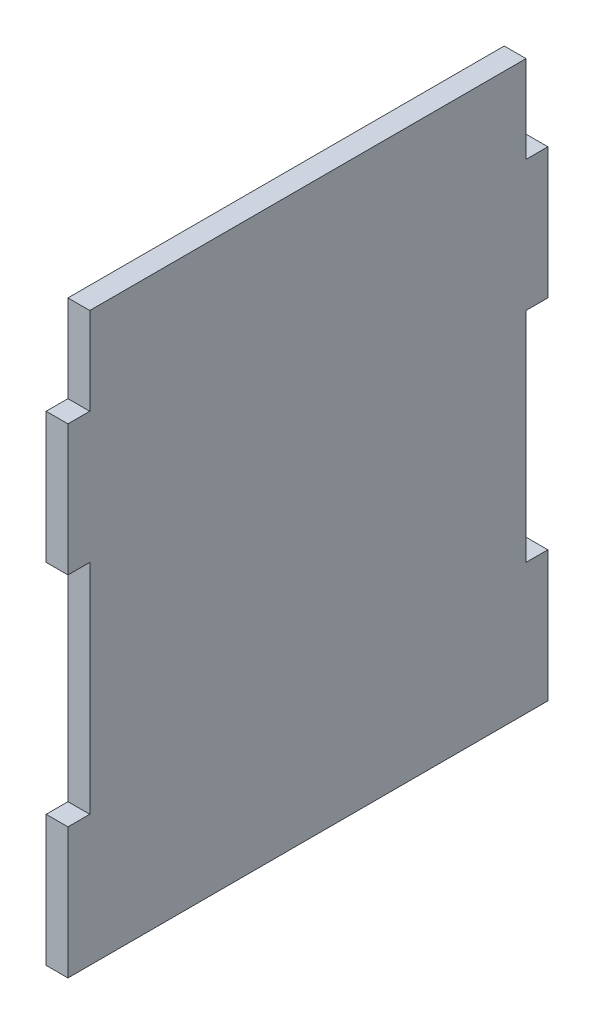
ISO-10303-21;
HEADER;
FILE_DESCRIPTION(('STEP AP214'),'2;1');
FILE_NAME('part.step','',(''),(''),'','','');
FILE_SCHEMA(('AUTOMOTIVE_DESIGN { 1 0 10303 214 1 1 1 1 }'));
ENDSEC;
DATA;
#1=APPLICATION_CONTEXT('core data for automotive mechanical design processes');
#2=APPLICATION_PROTOCOL_DEFINITION('international standard','automotive_design',2000,#1);
#3=PRODUCT_CONTEXT('',#1,'mechanical');
#4=PRODUCT('Part','Part','',(#3));
#5=PRODUCT_RELATED_PRODUCT_CATEGORY('part','',(#4));
#6=PRODUCT_DEFINITION_FORMATION('','',#4);
#7=PRODUCT_DEFINITION_CONTEXT('part definition',#1,'design');
#8=PRODUCT_DEFINITION('design','',#6,#7);
#9=PRODUCT_DEFINITION_SHAPE('','',#8);
#10=(LENGTH_UNIT() NAMED_UNIT(*) SI_UNIT(.MILLI.,.METRE.));
#11=(NAMED_UNIT(*) PLANE_ANGLE_UNIT() SI_UNIT($,.RADIAN.));
#12=(NAMED_UNIT(*) SI_UNIT($,.STERADIAN.) SOLID_ANGLE_UNIT());
#13=UNCERTAINTY_MEASURE_WITH_UNIT(LENGTH_MEASURE(1.E-05),#10,'distance_accuracy_value','');
#14=(GEOMETRIC_REPRESENTATION_CONTEXT(3) GLOBAL_UNCERTAINTY_ASSIGNED_CONTEXT((#13)) GLOBAL_UNIT_ASSIGNED_CONTEXT((#10,
#11,#12)) REPRESENTATION_CONTEXT('',''));
#15=CARTESIAN_POINT('',(0.,0.,0.));
#16=DIRECTION('',(0.,0.,1.));
#17=DIRECTION('',(1.,0.,0.));
#18=AXIS2_PLACEMENT_3D('',#15,#16,#17);
#19=CARTESIAN_POINT('',(3.175,0.,-66.675));
#20=DIRECTION('',(0.,0.,1.));
#21=DIRECTION('',(1.,0.,0.));
#22=AXIS2_PLACEMENT_3D('',#19,#20,#21);
#23=PLANE('',#22);
#24=DIRECTION('',(0.,1.,0.));
#25=VECTOR('',#24,1.);
#26=CARTESIAN_POINT('',(0.,0.,-66.675));
#27=LINE('',#26,#25);
#28=CARTESIAN_POINT('',(0.,0.,-66.675));
#29=VERTEX_POINT('',#28);
#30=CARTESIAN_POINT('',(0.,19.05,-66.675));
#31=VERTEX_POINT('',#30);
#32=EDGE_CURVE('E177',#29,#31,#27,.T.);
#33=ORIENTED_EDGE('',*,*,#32,.T.);
#34=DIRECTION('',(-1.,0.,0.));
#35=VECTOR('',#34,1.);
#36=CARTESIAN_POINT('',(3.175,19.05,-66.675));
#37=LINE('',#36,#35);
#38=CARTESIAN_POINT('',(3.175,19.05,-66.675));
#39=VERTEX_POINT('',#38);
#40=EDGE_CURVE('E41',#39,#31,#37,.T.);
#41=ORIENTED_EDGE('',*,*,#40,.F.);
#42=DIRECTION('',(0.,1.,0.));
#43=VECTOR('',#42,1.);
#44=CARTESIAN_POINT('',(3.175,0.,-66.675));
#45=LINE('',#44,#43);
#46=CARTESIAN_POINT('',(3.175,0.,-66.675));
#47=VERTEX_POINT('',#46);
#48=EDGE_CURVE('E294',#47,#39,#45,.T.);
#49=ORIENTED_EDGE('',*,*,#48,.F.);
#50=DIRECTION('',(-1.,0.,0.));
#51=VECTOR('',#50,1.);
#52=CARTESIAN_POINT('',(3.175,0.,-66.675));
#53=LINE('',#52,#51);
#54=EDGE_CURVE('E11',#47,#29,#53,.T.);
#55=ORIENTED_EDGE('',*,*,#54,.T.);
#56=EDGE_LOOP('',(#33,#41,#49,#55));
#57=FACE_BOUND('',#56,.T.);
#58=ADVANCED_FACE('F33',(#57),#23,.F.);
#59=CARTESIAN_POINT('',(3.175,19.05,-66.675));
#60=DIRECTION('',(0.,-1.,0.));
#61=DIRECTION('',(0.,0.,-1.));
#62=AXIS2_PLACEMENT_3D('',#59,#60,#61);
#63=PLANE('',#62);
#64=DIRECTION('',(0.,0.,1.));
#65=VECTOR('',#64,1.);
#66=CARTESIAN_POINT('',(0.,19.05,-66.675));
#67=LINE('',#66,#65);
#68=CARTESIAN_POINT('',(0.,19.05,-63.5));
#69=VERTEX_POINT('',#68);
#70=EDGE_CURVE('E179',#31,#69,#67,.T.);
#71=ORIENTED_EDGE('',*,*,#70,.T.);
#72=DIRECTION('',(-1.,0.,0.));
#73=VECTOR('',#72,1.);
#74=CARTESIAN_POINT('',(3.175,19.05,-63.5));
#75=LINE('',#74,#73);
#76=CARTESIAN_POINT('',(3.175,19.05,-63.5));
#77=VERTEX_POINT('',#76);
#78=EDGE_CURVE('E236',#77,#69,#75,.T.);
#79=ORIENTED_EDGE('',*,*,#78,.F.);
#80=DIRECTION('',(0.,0.,1.));
#81=VECTOR('',#80,1.);
#82=CARTESIAN_POINT('',(3.175,19.05,-66.675));
#83=LINE('',#82,#81);
#84=EDGE_CURVE('E245',#39,#77,#83,.T.);
#85=ORIENTED_EDGE('',*,*,#84,.F.);
#86=ORIENTED_EDGE('',*,*,#40,.T.);
#87=EDGE_LOOP('',(#71,#79,#85,#86));
#88=FACE_BOUND('',#87,.T.);
#89=ADVANCED_FACE('F243',(#88),#63,.F.);
#90=CARTESIAN_POINT('',(3.175,19.05,-63.5));
#91=DIRECTION('',(0.,0.,1.));
#92=DIRECTION('',(0.,-1.,0.));
#93=AXIS2_PLACEMENT_3D('',#90,#91,#92);
#94=PLANE('',#93);
#95=DIRECTION('',(0.,1.,0.));
#96=VECTOR('',#95,1.);
#97=CARTESIAN_POINT('',(0.,19.05,-63.5));
#98=LINE('',#97,#96);
#99=CARTESIAN_POINT('',(0.,50.8,-63.5000000000002));
#100=VERTEX_POINT('',#99);
#101=EDGE_CURVE('E181',#69,#100,#98,.T.);
#102=ORIENTED_EDGE('',*,*,#101,.T.);
#103=DIRECTION('',(-1.,0.,0.));
#104=VECTOR('',#103,1.);
#105=CARTESIAN_POINT('',(3.175,50.8,-63.5000000000002));
#106=LINE('',#105,#104);
#107=CARTESIAN_POINT('',(3.175,50.8,-63.5000000000002));
#108=VERTEX_POINT('',#107);
#109=EDGE_CURVE('E233',#108,#100,#106,.T.);
#110=ORIENTED_EDGE('',*,*,#109,.F.);
#111=DIRECTION('',(0.,1.,0.));
#112=VECTOR('',#111,1.);
#113=CARTESIAN_POINT('',(3.175,19.05,-63.5));
#114=LINE('',#113,#112);
#115=EDGE_CURVE('E266',#77,#108,#114,.T.);
#116=ORIENTED_EDGE('',*,*,#115,.F.);
#117=ORIENTED_EDGE('',*,*,#78,.T.);
#118=EDGE_LOOP('',(#102,#110,#116,#117));
#119=FACE_BOUND('',#118,.T.);
#120=ADVANCED_FACE('F257',(#119),#94,.F.);
#121=CARTESIAN_POINT('',(3.175,50.8,-63.5000000000002));
#122=DIRECTION('',(0.,1.,0.));
#123=DIRECTION('',(0.,0.,1.));
#124=AXIS2_PLACEMENT_3D('',#121,#122,#123);
#125=PLANE('',#124);
#126=DIRECTION('',(0.,0.,-1.));
#127=VECTOR('',#126,1.);
#128=CARTESIAN_POINT('',(0.,50.8,-63.5000000000002));
#129=LINE('',#128,#127);
#130=CARTESIAN_POINT('',(0.,50.8,-66.6750000000002));
#131=VERTEX_POINT('',#130);
#132=EDGE_CURVE('E183',#100,#131,#129,.T.);
#133=ORIENTED_EDGE('',*,*,#132,.T.);
#134=DIRECTION('',(-1.,0.,0.));
#135=VECTOR('',#134,1.);
#136=CARTESIAN_POINT('',(3.175,50.8,-66.6750000000002));
#137=LINE('',#136,#135);
#138=CARTESIAN_POINT('',(3.175,50.8,-66.6750000000002));
#139=VERTEX_POINT('',#138);
#140=EDGE_CURVE('E230',#139,#131,#137,.T.);
#141=ORIENTED_EDGE('',*,*,#140,.F.);
#142=DIRECTION('',(0.,0.,-1.));
#143=VECTOR('',#142,1.);
#144=CARTESIAN_POINT('',(3.175,50.8,-63.5000000000002));
#145=LINE('',#144,#143);
#146=EDGE_CURVE('E263',#108,#139,#145,.T.);
#147=ORIENTED_EDGE('',*,*,#146,.F.);
#148=ORIENTED_EDGE('',*,*,#109,.T.);
#149=EDGE_LOOP('',(#133,#141,#147,#148));
#150=FACE_BOUND('',#149,.T.);
#151=ADVANCED_FACE('F261',(#150),#125,.F.);
#152=CARTESIAN_POINT('',(3.175,50.8,-66.6750000000002));
#153=DIRECTION('',(0.,0.,1.));
#154=DIRECTION('',(1.,0.,0.));
#155=AXIS2_PLACEMENT_3D('',#152,#153,#154);
#156=PLANE('',#155);
#157=DIRECTION('',(0.,1.,0.));
#158=VECTOR('',#157,1.);
#159=CARTESIAN_POINT('',(0.,50.8,-66.6750000000002));
#160=LINE('',#159,#158);
#161=CARTESIAN_POINT('',(0.,69.85,-66.6750000000002));
#162=VERTEX_POINT('',#161);
#163=EDGE_CURVE('E185',#131,#162,#160,.T.);
#164=ORIENTED_EDGE('',*,*,#163,.T.);
#165=DIRECTION('',(-1.,0.,0.));
#166=VECTOR('',#165,1.);
#167=CARTESIAN_POINT('',(3.175,69.85,-66.6750000000002));
#168=LINE('',#167,#166);
#169=CARTESIAN_POINT('',(3.175,69.85,-66.6750000000002));
#170=VERTEX_POINT('',#169);
#171=EDGE_CURVE('E227',#170,#162,#168,.T.);
#172=ORIENTED_EDGE('',*,*,#171,.F.);
#173=DIRECTION('',(0.,1.,0.));
#174=VECTOR('',#173,1.);
#175=CARTESIAN_POINT('',(3.175,50.8,-66.6750000000002));
#176=LINE('',#175,#174);
#177=EDGE_CURVE('E265',#139,#170,#176,.T.);
#178=ORIENTED_EDGE('',*,*,#177,.F.);
#179=ORIENTED_EDGE('',*,*,#140,.T.);
#180=EDGE_LOOP('',(#164,#172,#178,#179));
#181=FACE_BOUND('',#180,.T.);
#182=ADVANCED_FACE('F308',(#181),#156,.F.);
#183=CARTESIAN_POINT('',(3.175,69.85,-66.6750000000002));
#184=DIRECTION('',(0.,-1.,0.));
#185=DIRECTION('',(0.,0.,-1.));
#186=AXIS2_PLACEMENT_3D('',#183,#184,#185);
#187=PLANE('',#186);
#188=DIRECTION('',(0.,0.,1.));
#189=VECTOR('',#188,1.);
#190=CARTESIAN_POINT('',(0.,69.85,-66.6750000000002));
#191=LINE('',#190,#189);
#192=CARTESIAN_POINT('',(0.,69.85,-63.5000000000002));
#193=VERTEX_POINT('',#192);
#194=EDGE_CURVE('E187',#162,#193,#191,.T.);
#195=ORIENTED_EDGE('',*,*,#194,.T.);
#196=DIRECTION('',(-1.,0.,0.));
#197=VECTOR('',#196,1.);
#198=CARTESIAN_POINT('',(3.175,69.85,-63.5000000000002));
#199=LINE('',#198,#197);
#200=CARTESIAN_POINT('',(3.175,69.85,-63.5000000000002));
#201=VERTEX_POINT('',#200);
#202=EDGE_CURVE('E224',#201,#193,#199,.T.);
#203=ORIENTED_EDGE('',*,*,#202,.F.);
#204=DIRECTION('',(0.,0.,1.));
#205=VECTOR('',#204,1.);
#206=CARTESIAN_POINT('',(3.175,69.85,-66.6750000000002));
#207=LINE('',#206,#205);
#208=EDGE_CURVE('E268',#170,#201,#207,.T.);
#209=ORIENTED_EDGE('',*,*,#208,.F.);
#210=ORIENTED_EDGE('',*,*,#171,.T.);
#211=EDGE_LOOP('',(#195,#203,#209,#210));
#212=FACE_BOUND('',#211,.T.);
#213=ADVANCED_FACE('F311',(#212),#187,.F.);
#214=CARTESIAN_POINT('',(3.175,69.85,-63.5000000000002));
#215=DIRECTION('',(0.,0.,1.));
#216=DIRECTION('',(0.,-1.,0.));
#217=AXIS2_PLACEMENT_3D('',#214,#215,#216);
#218=PLANE('',#217);
#219=DIRECTION('',(0.,1.,0.));
#220=VECTOR('',#219,1.);
#221=CARTESIAN_POINT('',(0.,69.85,-63.5000000000002));
#222=LINE('',#221,#220);
#223=CARTESIAN_POINT('',(0.,82.55,-63.5));
#224=VERTEX_POINT('',#223);
#225=EDGE_CURVE('E189',#193,#224,#222,.T.);
#226=ORIENTED_EDGE('',*,*,#225,.T.);
#227=DIRECTION('',(-1.,0.,0.));
#228=VECTOR('',#227,1.);
#229=CARTESIAN_POINT('',(3.175,82.55,-63.5));
#230=LINE('',#229,#228);
#231=CARTESIAN_POINT('',(3.175,82.55,-63.5));
#232=VERTEX_POINT('',#231);
#233=EDGE_CURVE('E221',#232,#224,#230,.T.);
#234=ORIENTED_EDGE('',*,*,#233,.F.);
#235=DIRECTION('',(0.,1.,0.));
#236=VECTOR('',#235,1.);
#237=CARTESIAN_POINT('',(3.175,69.85,-63.5000000000002));
#238=LINE('',#237,#236);
#239=EDGE_CURVE('E274',#201,#232,#238,.T.);
#240=ORIENTED_EDGE('',*,*,#239,.F.);
#241=ORIENTED_EDGE('',*,*,#202,.T.);
#242=EDGE_LOOP('',(#226,#234,#240,#241));
#243=FACE_BOUND('',#242,.T.);
#244=ADVANCED_FACE('F315',(#243),#218,.F.);
#245=CARTESIAN_POINT('',(3.175,82.55,0.));
#246=DIRECTION('',(0.,-1.,0.));
#247=DIRECTION('',(0.,0.,-1.));
#248=AXIS2_PLACEMENT_3D('',#245,#246,#247);
#249=PLANE('',#248);
#250=DIRECTION('',(0.,0.,1.));
#251=VECTOR('',#250,1.);
#252=CARTESIAN_POINT('',(0.,82.55,0.));
#253=LINE('',#252,#251);
#254=CARTESIAN_POINT('',(0.,82.55,0.));
#255=VERTEX_POINT('',#254);
#256=EDGE_CURVE('E191',#224,#255,#253,.T.);
#257=ORIENTED_EDGE('',*,*,#256,.T.);
#258=DIRECTION('',(-1.,0.,0.));
#259=VECTOR('',#258,1.);
#260=CARTESIAN_POINT('',(3.175,82.55,0.));
#261=LINE('',#260,#259);
#262=CARTESIAN_POINT('',(3.175,82.55,0.));
#263=VERTEX_POINT('',#262);
#264=EDGE_CURVE('E218',#263,#255,#261,.T.);
#265=ORIENTED_EDGE('',*,*,#264,.F.);
#266=DIRECTION('',(0.,0.,1.));
#267=VECTOR('',#266,1.);
#268=CARTESIAN_POINT('',(3.175,82.55,0.));
#269=LINE('',#268,#267);
#270=EDGE_CURVE('E276',#232,#263,#269,.T.);
#271=ORIENTED_EDGE('',*,*,#270,.F.);
#272=ORIENTED_EDGE('',*,*,#233,.T.);
#273=EDGE_LOOP('',(#257,#265,#271,#272));
#274=FACE_BOUND('',#273,.T.);
#275=ADVANCED_FACE('F319',(#274),#249,.F.);
#276=CARTESIAN_POINT('',(3.175,69.85,1.77367252013231E-13));
#277=DIRECTION('',(0.,0.,-1.));
#278=DIRECTION('',(0.,1.,0.));
#279=AXIS2_PLACEMENT_3D('',#276,#277,#278);
#280=PLANE('',#279);
#281=DIRECTION('',(0.,-1.,0.));
#282=VECTOR('',#281,1.);
#283=CARTESIAN_POINT('',(0.,69.85,1.77367252013231E-13));
#284=LINE('',#283,#282);
#285=CARTESIAN_POINT('',(0.,69.85,1.77367252013231E-13));
#286=VERTEX_POINT('',#285);
#287=EDGE_CURVE('E193',#255,#286,#284,.T.);
#288=ORIENTED_EDGE('',*,*,#287,.T.);
#289=DIRECTION('',(-1.,0.,0.));
#290=VECTOR('',#289,1.);
#291=CARTESIAN_POINT('',(3.175,69.85,1.77367252013231E-13));
#292=LINE('',#291,#290);
#293=CARTESIAN_POINT('',(3.175,69.85,1.77367252013231E-13));
#294=VERTEX_POINT('',#293);
#295=EDGE_CURVE('E215',#294,#286,#292,.T.);
#296=ORIENTED_EDGE('',*,*,#295,.F.);
#297=DIRECTION('',(0.,-1.,0.));
#298=VECTOR('',#297,1.);
#299=CARTESIAN_POINT('',(3.175,69.85,1.77367252013231E-13));
#300=LINE('',#299,#298);
#301=EDGE_CURVE('E278',#263,#294,#300,.T.);
#302=ORIENTED_EDGE('',*,*,#301,.F.);
#303=ORIENTED_EDGE('',*,*,#264,.T.);
#304=EDGE_LOOP('',(#288,#296,#302,#303));
#305=FACE_BOUND('',#304,.T.);
#306=ADVANCED_FACE('F323',(#305),#280,.F.);
#307=CARTESIAN_POINT('',(3.175,69.85,3.17500000000018));
#308=DIRECTION('',(0.,-1.,0.));
#309=DIRECTION('',(0.,0.,-1.));
#310=AXIS2_PLACEMENT_3D('',#307,#308,#309);
#311=PLANE('',#310);
#312=DIRECTION('',(0.,0.,1.));
#313=VECTOR('',#312,1.);
#314=CARTESIAN_POINT('',(0.,69.85,3.17500000000018));
#315=LINE('',#314,#313);
#316=CARTESIAN_POINT('',(0.,69.85,3.17500000000018));
#317=VERTEX_POINT('',#316);
#318=EDGE_CURVE('E195',#286,#317,#315,.T.);
#319=ORIENTED_EDGE('',*,*,#318,.T.);
#320=DIRECTION('',(-1.,0.,0.));
#321=VECTOR('',#320,1.);
#322=CARTESIAN_POINT('',(3.175,69.85,3.17500000000018));
#323=LINE('',#322,#321);
#324=CARTESIAN_POINT('',(3.175,69.85,3.17500000000018));
#325=VERTEX_POINT('',#324);
#326=EDGE_CURVE('E212',#325,#317,#323,.T.);
#327=ORIENTED_EDGE('',*,*,#326,.F.);
#328=DIRECTION('',(0.,0.,1.));
#329=VECTOR('',#328,1.);
#330=CARTESIAN_POINT('',(3.175,69.85,3.17500000000018));
#331=LINE('',#330,#329);
#332=EDGE_CURVE('E280',#294,#325,#331,.T.);
#333=ORIENTED_EDGE('',*,*,#332,.F.);
#334=ORIENTED_EDGE('',*,*,#295,.T.);
#335=EDGE_LOOP('',(#319,#327,#333,#334));
#336=FACE_BOUND('',#335,.T.);
#337=ADVANCED_FACE('F327',(#336),#311,.F.);
#338=CARTESIAN_POINT('',(3.175,50.8,3.17500000000018));
#339=DIRECTION('',(0.,0.,-1.));
#340=DIRECTION('',(-1.,0.,0.));
#341=AXIS2_PLACEMENT_3D('',#338,#339,#340);
#342=PLANE('',#341);
#343=DIRECTION('',(0.,-1.,0.));
#344=VECTOR('',#343,1.);
#345=CARTESIAN_POINT('',(0.,50.8,3.17500000000018));
#346=LINE('',#345,#344);
#347=CARTESIAN_POINT('',(0.,50.8,3.17500000000018));
#348=VERTEX_POINT('',#347);
#349=EDGE_CURVE('E197',#317,#348,#346,.T.);
#350=ORIENTED_EDGE('',*,*,#349,.T.);
#351=DIRECTION('',(-1.,0.,0.));
#352=VECTOR('',#351,1.);
#353=CARTESIAN_POINT('',(3.175,50.8,3.17500000000018));
#354=LINE('',#353,#352);
#355=CARTESIAN_POINT('',(3.175,50.8,3.17500000000018));
#356=VERTEX_POINT('',#355);
#357=EDGE_CURVE('E209',#356,#348,#354,.T.);
#358=ORIENTED_EDGE('',*,*,#357,.F.);
#359=DIRECTION('',(0.,-1.,0.));
#360=VECTOR('',#359,1.);
#361=CARTESIAN_POINT('',(3.175,50.8,3.17500000000018));
#362=LINE('',#361,#360);
#363=EDGE_CURVE('E282',#325,#356,#362,.T.);
#364=ORIENTED_EDGE('',*,*,#363,.F.);
#365=ORIENTED_EDGE('',*,*,#326,.T.);
#366=EDGE_LOOP('',(#350,#358,#364,#365));
#367=FACE_BOUND('',#366,.T.);
#368=ADVANCED_FACE('F288',(#367),#342,.F.);
#369=CARTESIAN_POINT('',(3.175,50.8,1.77367252013231E-13));
#370=DIRECTION('',(0.,1.,0.));
#371=DIRECTION('',(0.,0.,1.));
#372=AXIS2_PLACEMENT_3D('',#369,#370,#371);
#373=PLANE('',#372);
#374=DIRECTION('',(0.,0.,-1.));
#375=VECTOR('',#374,1.);
#376=CARTESIAN_POINT('',(0.,50.8,1.77367252013231E-13));
#377=LINE('',#376,#375);
#378=CARTESIAN_POINT('',(0.,50.8,1.77367252013231E-13));
#379=VERTEX_POINT('',#378);
#380=EDGE_CURVE('E199',#348,#379,#377,.T.);
#381=ORIENTED_EDGE('',*,*,#380,.T.);
#382=DIRECTION('',(-1.,0.,0.));
#383=VECTOR('',#382,1.);
#384=CARTESIAN_POINT('',(3.175,50.8,1.77367252013231E-13));
#385=LINE('',#384,#383);
#386=CARTESIAN_POINT('',(3.175,50.8,1.77367252013231E-13));
#387=VERTEX_POINT('',#386);
#388=EDGE_CURVE('E166',#387,#379,#385,.T.);
#389=ORIENTED_EDGE('',*,*,#388,.F.);
#390=DIRECTION('',(0.,0.,-1.));
#391=VECTOR('',#390,1.);
#392=CARTESIAN_POINT('',(3.175,50.8,1.77367252013231E-13));
#393=LINE('',#392,#391);
#394=EDGE_CURVE('E157',#356,#387,#393,.T.);
#395=ORIENTED_EDGE('',*,*,#394,.F.);
#396=ORIENTED_EDGE('',*,*,#357,.T.);
#397=EDGE_LOOP('',(#381,#389,#395,#396));
#398=FACE_BOUND('',#397,.T.);
#399=ADVANCED_FACE('F292',(#398),#373,.F.);
#400=CARTESIAN_POINT('',(3.175,19.05,0.));
#401=DIRECTION('',(0.,0.,-1.));
#402=DIRECTION('',(0.,1.,0.));
#403=AXIS2_PLACEMENT_3D('',#400,#401,#402);
#404=PLANE('',#403);
#405=DIRECTION('',(0.,-1.,0.));
#406=VECTOR('',#405,1.);
#407=CARTESIAN_POINT('',(0.,19.05,0.));
#408=LINE('',#407,#406);
#409=CARTESIAN_POINT('',(0.,19.05,0.));
#410=VERTEX_POINT('',#409);
#411=EDGE_CURVE('E165',#379,#410,#408,.T.);
#412=ORIENTED_EDGE('',*,*,#411,.T.);
#413=DIRECTION('',(-1.,0.,0.));
#414=VECTOR('',#413,1.);
#415=CARTESIAN_POINT('',(3.175,19.05,0.));
#416=LINE('',#415,#414);
#417=CARTESIAN_POINT('',(3.175,19.05,0.));
#418=VERTEX_POINT('',#417);
#419=EDGE_CURVE('E162',#418,#410,#416,.T.);
#420=ORIENTED_EDGE('',*,*,#419,.F.);
#421=DIRECTION('',(0.,-1.,0.));
#422=VECTOR('',#421,1.);
#423=CARTESIAN_POINT('',(3.175,19.05,0.));
#424=LINE('',#423,#422);
#425=EDGE_CURVE('E151',#387,#418,#424,.T.);
#426=ORIENTED_EDGE('',*,*,#425,.F.);
#427=ORIENTED_EDGE('',*,*,#388,.T.);
#428=EDGE_LOOP('',(#412,#420,#426,#427));
#429=FACE_BOUND('',#428,.T.);
#430=ADVANCED_FACE('F163',(#429),#404,.F.);
#431=CARTESIAN_POINT('',(3.175,19.05,3.175));
#432=DIRECTION('',(0.,-1.,0.));
#433=DIRECTION('',(0.,0.,-1.));
#434=AXIS2_PLACEMENT_3D('',#431,#432,#433);
#435=PLANE('',#434);
#436=DIRECTION('',(0.,0.,1.));
#437=VECTOR('',#436,1.);
#438=CARTESIAN_POINT('',(0.,19.05,3.175));
#439=LINE('',#438,#437);
#440=CARTESIAN_POINT('',(0.,19.05,3.175));
#441=VERTEX_POINT('',#440);
#442=EDGE_CURVE('E103',#410,#441,#439,.T.);
#443=ORIENTED_EDGE('',*,*,#442,.T.);
#444=DIRECTION('',(-1.,0.,0.));
#445=VECTOR('',#444,1.);
#446=CARTESIAN_POINT('',(3.175,19.05,3.175));
#447=LINE('',#446,#445);
#448=CARTESIAN_POINT('',(3.175,19.05,3.175));
#449=VERTEX_POINT('',#448);
#450=EDGE_CURVE('E167',#449,#441,#447,.T.);
#451=ORIENTED_EDGE('',*,*,#450,.F.);
#452=DIRECTION('',(0.,0.,1.));
#453=VECTOR('',#452,1.);
#454=CARTESIAN_POINT('',(3.175,19.05,3.175));
#455=LINE('',#454,#453);
#456=EDGE_CURVE('E155',#418,#449,#455,.T.);
#457=ORIENTED_EDGE('',*,*,#456,.F.);
#458=ORIENTED_EDGE('',*,*,#419,.T.);
#459=EDGE_LOOP('',(#443,#451,#457,#458));
#460=FACE_BOUND('',#459,.T.);
#461=ADVANCED_FACE('F169',(#460),#435,.F.);
#462=CARTESIAN_POINT('',(3.175,0.,3.175));
#463=DIRECTION('',(0.,0.,-1.));
#464=DIRECTION('',(-1.,0.,0.));
#465=AXIS2_PLACEMENT_3D('',#462,#463,#464);
#466=PLANE('',#465);
#467=DIRECTION('',(0.,-1.,0.));
#468=VECTOR('',#467,1.);
#469=CARTESIAN_POINT('',(0.,0.,3.175));
#470=LINE('',#469,#468);
#471=CARTESIAN_POINT('',(0.,0.,3.175));
#472=VERTEX_POINT('',#471);
#473=EDGE_CURVE('E110',#441,#472,#470,.T.);
#474=ORIENTED_EDGE('',*,*,#473,.T.);
#475=DIRECTION('',(-1.,0.,0.));
#476=VECTOR('',#475,1.);
#477=CARTESIAN_POINT('',(3.175,0.,3.175));
#478=LINE('',#477,#476);
#479=CARTESIAN_POINT('',(3.175,0.,3.175));
#480=VERTEX_POINT('',#479);
#481=EDGE_CURVE('E173',#480,#472,#478,.T.);
#482=ORIENTED_EDGE('',*,*,#481,.F.);
#483=DIRECTION('',(0.,-1.,0.));
#484=VECTOR('',#483,1.);
#485=CARTESIAN_POINT('',(3.175,0.,3.175));
#486=LINE('',#485,#484);
#487=EDGE_CURVE('E171',#449,#480,#486,.T.);
#488=ORIENTED_EDGE('',*,*,#487,.F.);
#489=ORIENTED_EDGE('',*,*,#450,.T.);
#490=EDGE_LOOP('',(#474,#482,#488,#489));
#491=FACE_BOUND('',#490,.T.);
#492=ADVANCED_FACE('F340',(#491),#466,.F.);
#493=CARTESIAN_POINT('',(3.175,0.,0.));
#494=DIRECTION('',(0.,1.,0.));
#495=DIRECTION('',(0.,0.,1.));
#496=AXIS2_PLACEMENT_3D('',#493,#494,#495);
#497=PLANE('',#496);
#498=DIRECTION('',(0.,0.,-1.));
#499=VECTOR('',#498,1.);
#500=CARTESIAN_POINT('',(0.,0.,0.));
#501=LINE('',#500,#499);
#502=EDGE_CURVE('E204',#472,#29,#501,.T.);
#503=ORIENTED_EDGE('',*,*,#502,.T.);
#504=ORIENTED_EDGE('',*,*,#54,.F.);
#505=DIRECTION('',(0.,0.,-1.));
#506=VECTOR('',#505,1.);
#507=CARTESIAN_POINT('',(3.175,0.,0.));
#508=LINE('',#507,#506);
#509=EDGE_CURVE('E49',#480,#47,#508,.T.);
#510=ORIENTED_EDGE('',*,*,#509,.F.);
#511=ORIENTED_EDGE('',*,*,#481,.T.);
#512=EDGE_LOOP('',(#503,#504,#510,#511));
#513=FACE_BOUND('',#512,.T.);
#514=ADVANCED_FACE('F293',(#513),#497,.F.);
#515=CARTESIAN_POINT('',(3.175,0.,0.));
#516=DIRECTION('',(1.,0.,0.));
#517=DIRECTION('',(0.,0.,-1.));
#518=AXIS2_PLACEMENT_3D('',#515,#516,#517);
#519=PLANE('',#518);
#520=ORIENTED_EDGE('',*,*,#509,.T.);
#521=ORIENTED_EDGE('',*,*,#48,.T.);
#522=ORIENTED_EDGE('',*,*,#84,.T.);
#523=ORIENTED_EDGE('',*,*,#115,.T.);
#524=ORIENTED_EDGE('',*,*,#146,.T.);
#525=ORIENTED_EDGE('',*,*,#177,.T.);
#526=ORIENTED_EDGE('',*,*,#208,.T.);
#527=ORIENTED_EDGE('',*,*,#239,.T.);
#528=ORIENTED_EDGE('',*,*,#270,.T.);
#529=ORIENTED_EDGE('',*,*,#301,.T.);
#530=ORIENTED_EDGE('',*,*,#332,.T.);
#531=ORIENTED_EDGE('',*,*,#363,.T.);
#532=ORIENTED_EDGE('',*,*,#394,.T.);
#533=ORIENTED_EDGE('',*,*,#425,.T.);
#534=ORIENTED_EDGE('',*,*,#456,.T.);
#535=ORIENTED_EDGE('',*,*,#487,.T.);
#536=EDGE_LOOP('',(#520,#521,#522,#523,#524,#525,#526,#527,#528,#529,#530,#531,#532,#533,#534,#535));
#537=FACE_BOUND('',#536,.T.);
#538=ADVANCED_FACE('F153',(#537),#519,.T.);
#539=CARTESIAN_POINT('',(0.,0.,0.));
#540=DIRECTION('',(1.,0.,0.));
#541=DIRECTION('',(0.,0.,-1.));
#542=AXIS2_PLACEMENT_3D('',#539,#540,#541);
#543=PLANE('',#542);
#544=ORIENTED_EDGE('',*,*,#32,.F.);
#545=ORIENTED_EDGE('',*,*,#502,.F.);
#546=ORIENTED_EDGE('',*,*,#473,.F.);
#547=ORIENTED_EDGE('',*,*,#442,.F.);
#548=ORIENTED_EDGE('',*,*,#411,.F.);
#549=ORIENTED_EDGE('',*,*,#380,.F.);
#550=ORIENTED_EDGE('',*,*,#349,.F.);
#551=ORIENTED_EDGE('',*,*,#318,.F.);
#552=ORIENTED_EDGE('',*,*,#287,.F.);
#553=ORIENTED_EDGE('',*,*,#256,.F.);
#554=ORIENTED_EDGE('',*,*,#225,.F.);
#555=ORIENTED_EDGE('',*,*,#194,.F.);
#556=ORIENTED_EDGE('',*,*,#163,.F.);
#557=ORIENTED_EDGE('',*,*,#132,.F.);
#558=ORIENTED_EDGE('',*,*,#101,.F.);
#559=ORIENTED_EDGE('',*,*,#70,.F.);
#560=EDGE_LOOP('',(#544,#545,#546,#547,#548,#549,#550,#551,#552,#553,#554,#555,#556,#557,#558,#559));
#561=FACE_BOUND('',#560,.T.);
#562=ADVANCED_FACE('F251',(#561),#543,.F.);
#563=CLOSED_SHELL('',(#58,#89,#120,#151,#182,#213,#244,#275,#306,#337,#368,#399,#430,#461,#492,
#514,#538,#562));
#564=MANIFOLD_SOLID_BREP('B2',#563);
#565=ADVANCED_BREP_SHAPE_REPRESENTATION('',(#18,#564),#14);
#566=SHAPE_DEFINITION_REPRESENTATION(#9,#565);
ENDSEC;
END-ISO-10303-21;
